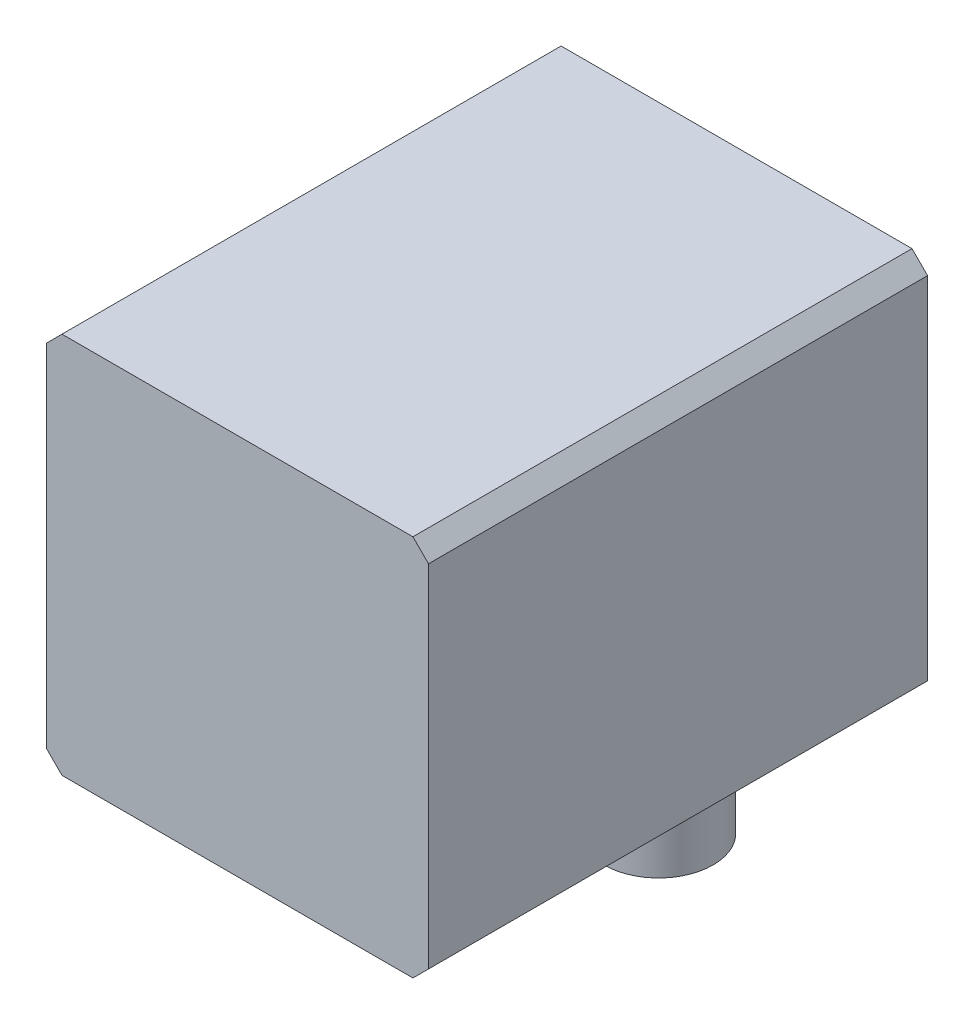
ISO-10303-21;
HEADER;
FILE_DESCRIPTION(('STEP AP214'),'2;1');
FILE_NAME('part.step','',(''),(''),'','','');
FILE_SCHEMA(('AUTOMOTIVE_DESIGN { 1 0 10303 214 1 1 1 1 }'));
ENDSEC;
DATA;
#1=APPLICATION_CONTEXT('core data for automotive mechanical design processes');
#2=APPLICATION_PROTOCOL_DEFINITION('international standard','automotive_design',2000,#1);
#3=PRODUCT_CONTEXT('',#1,'mechanical');
#4=PRODUCT('Part','Part','',(#3));
#5=PRODUCT_RELATED_PRODUCT_CATEGORY('part','',(#4));
#6=PRODUCT_DEFINITION_FORMATION('','',#4);
#7=PRODUCT_DEFINITION_CONTEXT('part definition',#1,'design');
#8=PRODUCT_DEFINITION('design','',#6,#7);
#9=PRODUCT_DEFINITION_SHAPE('','',#8);
#10=(LENGTH_UNIT() NAMED_UNIT(*) SI_UNIT(.MILLI.,.METRE.));
#11=(NAMED_UNIT(*) PLANE_ANGLE_UNIT() SI_UNIT($,.RADIAN.));
#12=(NAMED_UNIT(*) SI_UNIT($,.STERADIAN.) SOLID_ANGLE_UNIT());
#13=UNCERTAINTY_MEASURE_WITH_UNIT(LENGTH_MEASURE(1.E-05),#10,'distance_accuracy_value','');
#14=(GEOMETRIC_REPRESENTATION_CONTEXT(3) GLOBAL_UNCERTAINTY_ASSIGNED_CONTEXT((#13)) GLOBAL_UNIT_ASSIGNED_CONTEXT((#10,
#11,#12)) REPRESENTATION_CONTEXT('',''));
#15=CARTESIAN_POINT('',(0.,0.,0.));
#16=DIRECTION('',(0.,0.,1.));
#17=DIRECTION('',(1.,0.,0.));
#18=AXIS2_PLACEMENT_3D('',#15,#16,#17);
#19=CARTESIAN_POINT('',(-61.25,61.25,160.));
#20=DIRECTION('',(1.,0.,0.));
#21=DIRECTION('',(0.,1.,0.));
#22=AXIS2_PLACEMENT_3D('',#19,#20,#21);
#23=PLANE('',#22);
#24=DIRECTION('',(0.,-1.,0.));
#25=VECTOR('',#24,1.);
#26=CARTESIAN_POINT('',(-61.25,61.25,160.));
#27=LINE('',#26,#25);
#28=CARTESIAN_POINT('',(-61.25,56.25,160.));
#29=VERTEX_POINT('',#28);
#30=CARTESIAN_POINT('',(-61.25,-56.25,160.));
#31=VERTEX_POINT('',#30);
#32=EDGE_CURVE('E138',#29,#31,#27,.T.);
#33=ORIENTED_EDGE('',*,*,#32,.F.);
#34=DIRECTION('',(0.,0.,-1.));
#35=VECTOR('',#34,1.);
#36=CARTESIAN_POINT('',(-61.25,56.25,160.));
#37=LINE('',#36,#35);
#38=CARTESIAN_POINT('',(-61.25,56.25,0.));
#39=VERTEX_POINT('',#38);
#40=EDGE_CURVE('E11',#29,#39,#37,.T.);
#41=ORIENTED_EDGE('',*,*,#40,.T.);
#42=DIRECTION('',(0.,-1.,0.));
#43=VECTOR('',#42,1.);
#44=CARTESIAN_POINT('',(-61.25,61.25,0.));
#45=LINE('',#44,#43);
#46=CARTESIAN_POINT('',(-61.25,-56.25,0.));
#47=VERTEX_POINT('',#46);
#48=EDGE_CURVE('E173',#39,#47,#45,.T.);
#49=ORIENTED_EDGE('',*,*,#48,.T.);
#50=DIRECTION('',(0.,0.,1.));
#51=VECTOR('',#50,1.);
#52=CARTESIAN_POINT('',(-61.25,-56.25,160.));
#53=LINE('',#52,#51);
#54=EDGE_CURVE('E52',#47,#31,#53,.T.);
#55=ORIENTED_EDGE('',*,*,#54,.T.);
#56=EDGE_LOOP('',(#33,#41,#49,#55));
#57=FACE_BOUND('',#56,.T.);
#58=ADVANCED_FACE('F43',(#57),#23,.F.);
#59=CARTESIAN_POINT('',(-61.25,-61.25,160.));
#60=DIRECTION('',(0.,1.,0.));
#61=DIRECTION('',(0.,0.,1.));
#62=AXIS2_PLACEMENT_3D('',#59,#60,#61);
#63=PLANE('',#62);
#64=CARTESIAN_POINT('',(0.,-61.25,25.));
#65=DIRECTION('',(0.,1.,0.));
#66=DIRECTION('',(0.,0.,1.));
#67=AXIS2_PLACEMENT_3D('',#64,#65,#66);
#68=CIRCLE('',#67,17.5);
#69=CARTESIAN_POINT('',(0.,-61.25,42.5));
#70=VERTEX_POINT('',#69);
#71=EDGE_CURVE('E147',#70,#70,#68,.F.);
#72=ORIENTED_EDGE('',*,*,#71,.F.);
#73=EDGE_LOOP('',(#72));
#74=FACE_BOUND('',#73,.T.);
#75=DIRECTION('',(1.,0.,0.));
#76=VECTOR('',#75,1.);
#77=CARTESIAN_POINT('',(-61.25,-61.25,0.));
#78=LINE('',#77,#76);
#79=CARTESIAN_POINT('',(-56.25,-61.25,0.));
#80=VERTEX_POINT('',#79);
#81=CARTESIAN_POINT('',(56.25,-61.25,0.));
#82=VERTEX_POINT('',#81);
#83=EDGE_CURVE('E143',#80,#82,#78,.T.);
#84=ORIENTED_EDGE('',*,*,#83,.T.);
#85=DIRECTION('',(0.,0.,1.));
#86=VECTOR('',#85,1.);
#87=CARTESIAN_POINT('',(56.25,-61.25,160.));
#88=LINE('',#87,#86);
#89=CARTESIAN_POINT('',(56.25,-61.25,160.));
#90=VERTEX_POINT('',#89);
#91=EDGE_CURVE('E59',#82,#90,#88,.T.);
#92=ORIENTED_EDGE('',*,*,#91,.T.);
#93=DIRECTION('',(1.,0.,0.));
#94=VECTOR('',#93,1.);
#95=CARTESIAN_POINT('',(-61.25,-61.25,160.));
#96=LINE('',#95,#94);
#97=CARTESIAN_POINT('',(-56.25,-61.25,160.));
#98=VERTEX_POINT('',#97);
#99=EDGE_CURVE('E141',#98,#90,#96,.T.);
#100=ORIENTED_EDGE('',*,*,#99,.F.);
#101=DIRECTION('',(0.,0.,-1.));
#102=VECTOR('',#101,1.);
#103=CARTESIAN_POINT('',(-56.25,-61.25,160.));
#104=LINE('',#103,#102);
#105=EDGE_CURVE('E165',#98,#80,#104,.T.);
#106=ORIENTED_EDGE('',*,*,#105,.T.);
#107=EDGE_LOOP('',(#84,#92,#100,#106));
#108=FACE_BOUND('',#107,.T.);
#109=ADVANCED_FACE('F180',(#74,#108),#63,.F.);
#110=CARTESIAN_POINT('',(61.25,61.25,160.));
#111=DIRECTION('',(-1.,0.,0.));
#112=DIRECTION('',(0.,-1.,0.));
#113=AXIS2_PLACEMENT_3D('',#110,#111,#112);
#114=PLANE('',#113);
#115=DIRECTION('',(0.,1.,0.));
#116=VECTOR('',#115,1.);
#117=CARTESIAN_POINT('',(61.25,61.25,0.));
#118=LINE('',#117,#116);
#119=CARTESIAN_POINT('',(61.25,-56.25,0.));
#120=VERTEX_POINT('',#119);
#121=CARTESIAN_POINT('',(61.25,56.25,0.));
#122=VERTEX_POINT('',#121);
#123=EDGE_CURVE('E139',#120,#122,#118,.T.);
#124=ORIENTED_EDGE('',*,*,#123,.T.);
#125=DIRECTION('',(0.,0.,1.));
#126=VECTOR('',#125,1.);
#127=CARTESIAN_POINT('',(61.25,56.25,160.));
#128=LINE('',#127,#126);
#129=CARTESIAN_POINT('',(61.25,56.25,160.));
#130=VERTEX_POINT('',#129);
#131=EDGE_CURVE('E116',#122,#130,#128,.T.);
#132=ORIENTED_EDGE('',*,*,#131,.T.);
#133=DIRECTION('',(0.,1.,0.));
#134=VECTOR('',#133,1.);
#135=CARTESIAN_POINT('',(61.25,61.25,160.));
#136=LINE('',#135,#134);
#137=CARTESIAN_POINT('',(61.25,-56.25,160.));
#138=VERTEX_POINT('',#137);
#139=EDGE_CURVE('E185',#138,#130,#136,.T.);
#140=ORIENTED_EDGE('',*,*,#139,.F.);
#141=DIRECTION('',(0.,0.,-1.));
#142=VECTOR('',#141,1.);
#143=CARTESIAN_POINT('',(61.25,-56.25,160.));
#144=LINE('',#143,#142);
#145=EDGE_CURVE('E121',#138,#120,#144,.T.);
#146=ORIENTED_EDGE('',*,*,#145,.T.);
#147=EDGE_LOOP('',(#124,#132,#140,#146));
#148=FACE_BOUND('',#147,.T.);
#149=ADVANCED_FACE('F255',(#148),#114,.F.);
#150=CARTESIAN_POINT('',(-61.25,61.25,160.));
#151=DIRECTION('',(0.,-1.,0.));
#152=DIRECTION('',(0.,0.,-1.));
#153=AXIS2_PLACEMENT_3D('',#150,#151,#152);
#154=PLANE('',#153);
#155=DIRECTION('',(-1.,0.,0.));
#156=VECTOR('',#155,1.);
#157=CARTESIAN_POINT('',(-61.25,61.25,160.));
#158=LINE('',#157,#156);
#159=CARTESIAN_POINT('',(56.25,61.25,160.));
#160=VERTEX_POINT('',#159);
#161=CARTESIAN_POINT('',(-56.2499999999999,61.25,160.));
#162=VERTEX_POINT('',#161);
#163=EDGE_CURVE('E131',#160,#162,#158,.T.);
#164=ORIENTED_EDGE('',*,*,#163,.F.);
#165=DIRECTION('',(0.,0.,-1.));
#166=VECTOR('',#165,1.);
#167=CARTESIAN_POINT('',(56.25,61.25,160.));
#168=LINE('',#167,#166);
#169=CARTESIAN_POINT('',(56.25,61.25,0.));
#170=VERTEX_POINT('',#169);
#171=EDGE_CURVE('E115',#160,#170,#168,.T.);
#172=ORIENTED_EDGE('',*,*,#171,.T.);
#173=DIRECTION('',(-1.,0.,0.));
#174=VECTOR('',#173,1.);
#175=CARTESIAN_POINT('',(-61.25,61.25,0.));
#176=LINE('',#175,#174);
#177=CARTESIAN_POINT('',(-56.2499999999999,61.25,0.));
#178=VERTEX_POINT('',#177);
#179=EDGE_CURVE('E128',#170,#178,#176,.T.);
#180=ORIENTED_EDGE('',*,*,#179,.T.);
#181=DIRECTION('',(0.,0.,1.));
#182=VECTOR('',#181,1.);
#183=CARTESIAN_POINT('',(-56.2499999999999,61.25,160.));
#184=LINE('',#183,#182);
#185=EDGE_CURVE('E133',#178,#162,#184,.T.);
#186=ORIENTED_EDGE('',*,*,#185,.T.);
#187=EDGE_LOOP('',(#164,#172,#180,#186));
#188=FACE_BOUND('',#187,.T.);
#189=ADVANCED_FACE('F127',(#188),#154,.F.);
#190=CARTESIAN_POINT('',(0.,0.,160.));
#191=DIRECTION('',(0.,0.,1.));
#192=DIRECTION('',(1.,0.,0.));
#193=AXIS2_PLACEMENT_3D('',#190,#191,#192);
#194=PLANE('',#193);
#195=ORIENTED_EDGE('',*,*,#139,.T.);
#196=DIRECTION('',(0.707106781186546,-0.707106781186549,0.));
#197=VECTOR('',#196,1.);
#198=CARTESIAN_POINT('',(58.7500000000001,58.7499999999998,160.));
#199=LINE('',#198,#197);
#200=EDGE_CURVE('E163',#130,#160,#199,.F.);
#201=ORIENTED_EDGE('',*,*,#200,.T.);
#202=ORIENTED_EDGE('',*,*,#163,.T.);
#203=DIRECTION('',(0.707106781186549,0.707106781186546,0.));
#204=VECTOR('',#203,1.);
#205=CARTESIAN_POINT('',(-58.7499999999998,58.7500000000001,160.));
#206=LINE('',#205,#204);
#207=EDGE_CURVE('E159',#162,#29,#206,.F.);
#208=ORIENTED_EDGE('',*,*,#207,.T.);
#209=ORIENTED_EDGE('',*,*,#32,.T.);
#210=DIRECTION('',(-0.707106781186546,0.707106781186549,0.));
#211=VECTOR('',#210,1.);
#212=CARTESIAN_POINT('',(-58.7500000000001,-58.7499999999999,160.));
#213=LINE('',#212,#211);
#214=EDGE_CURVE('E66',#31,#98,#213,.F.);
#215=ORIENTED_EDGE('',*,*,#214,.T.);
#216=ORIENTED_EDGE('',*,*,#99,.T.);
#217=DIRECTION('',(-0.70710678118655,-0.707106781186545,0.));
#218=VECTOR('',#217,1.);
#219=CARTESIAN_POINT('',(58.7499999999998,-58.7500000000002,160.));
#220=LINE('',#219,#218);
#221=EDGE_CURVE('E161',#90,#138,#220,.F.);
#222=ORIENTED_EDGE('',*,*,#221,.T.);
#223=EDGE_LOOP('',(#195,#201,#202,#208,#209,#215,#216,#222));
#224=FACE_BOUND('',#223,.T.);
#225=ADVANCED_FACE('F176',(#224),#194,.T.);
#226=CARTESIAN_POINT('',(0.,0.,0.));
#227=DIRECTION('',(0.,0.,1.));
#228=DIRECTION('',(1.,0.,0.));
#229=AXIS2_PLACEMENT_3D('',#226,#227,#228);
#230=PLANE('',#229);
#231=CARTESIAN_POINT('',(48.,-48.,0.));
#232=DIRECTION('',(0.,0.,-1.));
#233=DIRECTION('',(-1.,0.,0.));
#234=AXIS2_PLACEMENT_3D('',#231,#232,#233);
#235=CIRCLE('',#234,2.75);
#236=CARTESIAN_POINT('',(45.25,-48.,0.));
#237=VERTEX_POINT('',#236);
#238=EDGE_CURVE('E202',#237,#237,#235,.T.);
#239=ORIENTED_EDGE('',*,*,#238,.F.);
#240=EDGE_LOOP('',(#239));
#241=FACE_BOUND('',#240,.T.);
#242=CARTESIAN_POINT('',(-48.,-48.,0.));
#243=DIRECTION('',(0.,0.,-1.));
#244=DIRECTION('',(-1.,0.,0.));
#245=AXIS2_PLACEMENT_3D('',#242,#243,#244);
#246=CIRCLE('',#245,2.75);
#247=CARTESIAN_POINT('',(-50.75,-48.,0.));
#248=VERTEX_POINT('',#247);
#249=EDGE_CURVE('E208',#248,#248,#246,.T.);
#250=ORIENTED_EDGE('',*,*,#249,.F.);
#251=EDGE_LOOP('',(#250));
#252=FACE_BOUND('',#251,.T.);
#253=CARTESIAN_POINT('',(-48.,48.,0.));
#254=DIRECTION('',(0.,0.,-1.));
#255=DIRECTION('',(-1.,0.,0.));
#256=AXIS2_PLACEMENT_3D('',#253,#254,#255);
#257=CIRCLE('',#256,2.75);
#258=CARTESIAN_POINT('',(-50.75,48.,0.));
#259=VERTEX_POINT('',#258);
#260=EDGE_CURVE('E214',#259,#259,#257,.T.);
#261=ORIENTED_EDGE('',*,*,#260,.F.);
#262=EDGE_LOOP('',(#261));
#263=FACE_BOUND('',#262,.T.);
#264=CARTESIAN_POINT('',(48.,48.,0.));
#265=DIRECTION('',(0.,0.,-1.));
#266=DIRECTION('',(-1.,0.,0.));
#267=AXIS2_PLACEMENT_3D('',#264,#265,#266);
#268=CIRCLE('',#267,2.75);
#269=CARTESIAN_POINT('',(45.25,48.,0.));
#270=VERTEX_POINT('',#269);
#271=EDGE_CURVE('E196',#270,#270,#268,.T.);
#272=ORIENTED_EDGE('',*,*,#271,.F.);
#273=EDGE_LOOP('',(#272));
#274=FACE_BOUND('',#273,.T.);
#275=ORIENTED_EDGE('',*,*,#179,.F.);
#276=DIRECTION('',(-0.707106781186546,0.707106781186549,0.));
#277=VECTOR('',#276,1.);
#278=CARTESIAN_POINT('',(56.25,61.25,0.));
#279=LINE('',#278,#277);
#280=EDGE_CURVE('E111',#170,#122,#279,.F.);
#281=ORIENTED_EDGE('',*,*,#280,.T.);
#282=ORIENTED_EDGE('',*,*,#123,.F.);
#283=DIRECTION('',(0.70710678118655,0.707106781186545,0.));
#284=VECTOR('',#283,1.);
#285=CARTESIAN_POINT('',(61.25,-56.25,0.));
#286=LINE('',#285,#284);
#287=EDGE_CURVE('E122',#120,#82,#286,.F.);
#288=ORIENTED_EDGE('',*,*,#287,.T.);
#289=ORIENTED_EDGE('',*,*,#83,.F.);
#290=DIRECTION('',(0.707106781186546,-0.707106781186549,0.));
#291=VECTOR('',#290,1.);
#292=CARTESIAN_POINT('',(-56.25,-61.25,0.));
#293=LINE('',#292,#291);
#294=EDGE_CURVE('E132',#80,#47,#293,.F.);
#295=ORIENTED_EDGE('',*,*,#294,.T.);
#296=ORIENTED_EDGE('',*,*,#48,.F.);
#297=DIRECTION('',(-0.707106781186549,-0.707106781186546,0.));
#298=VECTOR('',#297,1.);
#299=CARTESIAN_POINT('',(-61.25,56.25,0.));
#300=LINE('',#299,#298);
#301=EDGE_CURVE('E137',#39,#178,#300,.F.);
#302=ORIENTED_EDGE('',*,*,#301,.T.);
#303=EDGE_LOOP('',(#275,#281,#282,#288,#289,#295,#296,#302));
#304=FACE_BOUND('',#303,.T.);
#305=ADVANCED_FACE('F135',(#241,#252,#263,#274,#304),#230,.F.);
#306=CARTESIAN_POINT('',(0.,-116.75,25.));
#307=DIRECTION('',(0.,1.,0.));
#308=DIRECTION('',(0.,0.,1.));
#309=AXIS2_PLACEMENT_3D('',#306,#307,#308);
#310=CYLINDRICAL_SURFACE('',#309,17.5);
#311=CARTESIAN_POINT('',(0.,-116.75,25.));
#312=DIRECTION('',(0.,-1.,0.));
#313=DIRECTION('',(0.,0.,-1.));
#314=AXIS2_PLACEMENT_3D('',#311,#312,#313);
#315=CIRCLE('',#314,17.5);
#316=CARTESIAN_POINT('',(0.,-116.75,7.5));
#317=VERTEX_POINT('',#316);
#318=EDGE_CURVE('E181',#317,#317,#315,.T.);
#319=ORIENTED_EDGE('',*,*,#318,.F.);
#320=EDGE_LOOP('',(#319));
#321=FACE_BOUND('',#320,.T.);
#322=ORIENTED_EDGE('',*,*,#71,.T.);
#323=EDGE_LOOP('',(#322));
#324=FACE_BOUND('',#323,.T.);
#325=ADVANCED_FACE('F231',(#321,#324),#310,.T.);
#326=CARTESIAN_POINT('',(0.,-116.75,25.));
#327=DIRECTION('',(0.,-1.,0.));
#328=DIRECTION('',(0.,0.,-1.));
#329=AXIS2_PLACEMENT_3D('',#326,#327,#328);
#330=PLANE('',#329);
#331=CARTESIAN_POINT('',(0.,-116.75,25.));
#332=DIRECTION('',(0.,-1.,0.));
#333=DIRECTION('',(0.,0.,-1.));
#334=AXIS2_PLACEMENT_3D('',#331,#332,#333);
#335=CIRCLE('',#334,6.);
#336=CARTESIAN_POINT('',(0.,-116.75,19.));
#337=VERTEX_POINT('',#336);
#338=EDGE_CURVE('E150',#337,#337,#335,.T.);
#339=ORIENTED_EDGE('',*,*,#338,.F.);
#340=EDGE_LOOP('',(#339));
#341=FACE_BOUND('',#340,.T.);
#342=ORIENTED_EDGE('',*,*,#318,.T.);
#343=EDGE_LOOP('',(#342));
#344=FACE_BOUND('',#343,.T.);
#345=ADVANCED_FACE('F293',(#341,#344),#330,.T.);
#346=CARTESIAN_POINT('',(0.,-121.75,25.));
#347=DIRECTION('',(0.,1.,0.));
#348=DIRECTION('',(0.,0.,1.));
#349=AXIS2_PLACEMENT_3D('',#346,#347,#348);
#350=CYLINDRICAL_SURFACE('',#349,6.);
#351=CARTESIAN_POINT('',(0.,-121.75,25.));
#352=DIRECTION('',(0.,-1.,0.));
#353=DIRECTION('',(0.,0.,-1.));
#354=AXIS2_PLACEMENT_3D('',#351,#352,#353);
#355=CIRCLE('',#354,6.);
#356=CARTESIAN_POINT('',(0.,-121.75,19.));
#357=VERTEX_POINT('',#356);
#358=EDGE_CURVE('E190',#357,#357,#355,.T.);
#359=ORIENTED_EDGE('',*,*,#358,.F.);
#360=EDGE_LOOP('',(#359));
#361=FACE_BOUND('',#360,.T.);
#362=ORIENTED_EDGE('',*,*,#338,.T.);
#363=EDGE_LOOP('',(#362));
#364=FACE_BOUND('',#363,.T.);
#365=ADVANCED_FACE('F297',(#361,#364),#350,.T.);
#366=CARTESIAN_POINT('',(0.,-121.75,25.));
#367=DIRECTION('',(0.,-1.,0.));
#368=DIRECTION('',(0.,0.,-1.));
#369=AXIS2_PLACEMENT_3D('',#366,#367,#368);
#370=PLANE('',#369);
#371=ORIENTED_EDGE('',*,*,#358,.T.);
#372=EDGE_LOOP('',(#371));
#373=FACE_BOUND('',#372,.T.);
#374=ADVANCED_FACE('F267',(#373),#370,.T.);
#375=CARTESIAN_POINT('',(56.25,61.25,160.));
#376=DIRECTION('',(-0.707106781186549,-0.707106781186545,0.));
#377=DIRECTION('',(0.,0.,-1.));
#378=AXIS2_PLACEMENT_3D('',#375,#376,#377);
#379=PLANE('',#378);
#380=ORIENTED_EDGE('',*,*,#200,.F.);
#381=ORIENTED_EDGE('',*,*,#131,.F.);
#382=ORIENTED_EDGE('',*,*,#280,.F.);
#383=ORIENTED_EDGE('',*,*,#171,.F.);
#384=EDGE_LOOP('',(#380,#381,#382,#383));
#385=FACE_BOUND('',#384,.T.);
#386=ADVANCED_FACE('F114',(#385),#379,.F.);
#387=CARTESIAN_POINT('',(61.25,-56.25,160.));
#388=DIRECTION('',(-0.707106781186545,0.70710678118655,0.));
#389=DIRECTION('',(0.,0.,-1.));
#390=AXIS2_PLACEMENT_3D('',#387,#388,#389);
#391=PLANE('',#390);
#392=ORIENTED_EDGE('',*,*,#221,.F.);
#393=ORIENTED_EDGE('',*,*,#91,.F.);
#394=ORIENTED_EDGE('',*,*,#287,.F.);
#395=ORIENTED_EDGE('',*,*,#145,.F.);
#396=EDGE_LOOP('',(#392,#393,#394,#395));
#397=FACE_BOUND('',#396,.T.);
#398=ADVANCED_FACE('F266',(#397),#391,.F.);
#399=CARTESIAN_POINT('',(-61.25,56.25,160.));
#400=DIRECTION('',(0.707106781186546,-0.707106781186549,0.));
#401=DIRECTION('',(0.,0.,-1.));
#402=AXIS2_PLACEMENT_3D('',#399,#400,#401);
#403=PLANE('',#402);
#404=ORIENTED_EDGE('',*,*,#207,.F.);
#405=ORIENTED_EDGE('',*,*,#185,.F.);
#406=ORIENTED_EDGE('',*,*,#301,.F.);
#407=ORIENTED_EDGE('',*,*,#40,.F.);
#408=EDGE_LOOP('',(#404,#405,#406,#407));
#409=FACE_BOUND('',#408,.T.);
#410=ADVANCED_FACE('F246',(#409),#403,.F.);
#411=CARTESIAN_POINT('',(-56.25,-61.25,160.));
#412=DIRECTION('',(0.707106781186549,0.707106781186546,0.));
#413=DIRECTION('',(0.,0.,-1.));
#414=AXIS2_PLACEMENT_3D('',#411,#412,#413);
#415=PLANE('',#414);
#416=ORIENTED_EDGE('',*,*,#214,.F.);
#417=ORIENTED_EDGE('',*,*,#54,.F.);
#418=ORIENTED_EDGE('',*,*,#294,.F.);
#419=ORIENTED_EDGE('',*,*,#105,.F.);
#420=EDGE_LOOP('',(#416,#417,#418,#419));
#421=FACE_BOUND('',#420,.T.);
#422=ADVANCED_FACE('F46',(#421),#415,.F.);
#423=CARTESIAN_POINT('',(48.,48.,20.));
#424=DIRECTION('',(0.,0.,-1.));
#425=DIRECTION('',(-1.,0.,0.));
#426=AXIS2_PLACEMENT_3D('',#423,#424,#425);
#427=CYLINDRICAL_SURFACE('',#426,2.75);
#428=CARTESIAN_POINT('',(48.,48.,20.));
#429=DIRECTION('',(0.,0.,-1.));
#430=DIRECTION('',(-1.,0.,0.));
#431=AXIS2_PLACEMENT_3D('',#428,#429,#430);
#432=CIRCLE('',#431,2.75);
#433=CARTESIAN_POINT('',(45.25,48.,20.));
#434=VERTEX_POINT('',#433);
#435=EDGE_CURVE('E195',#434,#434,#432,.T.);
#436=ORIENTED_EDGE('',*,*,#435,.F.);
#437=EDGE_LOOP('',(#436));
#438=FACE_BOUND('',#437,.T.);
#439=ORIENTED_EDGE('',*,*,#271,.T.);
#440=EDGE_LOOP('',(#439));
#441=FACE_BOUND('',#440,.T.);
#442=ADVANCED_FACE('F236',(#438,#441),#427,.F.);
#443=CARTESIAN_POINT('',(48.,48.,20.));
#444=DIRECTION('',(0.,0.,-1.));
#445=DIRECTION('',(-1.,0.,0.));
#446=AXIS2_PLACEMENT_3D('',#443,#444,#445);
#447=PLANE('',#446);
#448=ORIENTED_EDGE('',*,*,#435,.T.);
#449=EDGE_LOOP('',(#448));
#450=FACE_BOUND('',#449,.T.);
#451=ADVANCED_FACE('F225',(#450),#447,.T.);
#452=CARTESIAN_POINT('',(-48.,48.,20.));
#453=DIRECTION('',(0.,0.,-1.));
#454=DIRECTION('',(-1.,0.,0.));
#455=AXIS2_PLACEMENT_3D('',#452,#453,#454);
#456=CYLINDRICAL_SURFACE('',#455,2.75);
#457=CARTESIAN_POINT('',(-48.,48.,20.));
#458=DIRECTION('',(0.,0.,-1.));
#459=DIRECTION('',(-1.,0.,0.));
#460=AXIS2_PLACEMENT_3D('',#457,#458,#459);
#461=CIRCLE('',#460,2.75);
#462=CARTESIAN_POINT('',(-50.75,48.,20.));
#463=VERTEX_POINT('',#462);
#464=EDGE_CURVE('E199',#463,#463,#461,.T.);
#465=ORIENTED_EDGE('',*,*,#464,.F.);
#466=EDGE_LOOP('',(#465));
#467=FACE_BOUND('',#466,.T.);
#468=ORIENTED_EDGE('',*,*,#260,.T.);
#469=EDGE_LOOP('',(#468));
#470=FACE_BOUND('',#469,.T.);
#471=ADVANCED_FACE('F222',(#467,#470),#456,.F.);
#472=CARTESIAN_POINT('',(-48.,48.,20.));
#473=DIRECTION('',(0.,0.,-1.));
#474=DIRECTION('',(-1.,0.,0.));
#475=AXIS2_PLACEMENT_3D('',#472,#473,#474);
#476=PLANE('',#475);
#477=ORIENTED_EDGE('',*,*,#464,.T.);
#478=EDGE_LOOP('',(#477));
#479=FACE_BOUND('',#478,.T.);
#480=ADVANCED_FACE('F220',(#479),#476,.T.);
#481=CARTESIAN_POINT('',(-48.,-48.,20.));
#482=DIRECTION('',(0.,0.,-1.));
#483=DIRECTION('',(-1.,0.,0.));
#484=AXIS2_PLACEMENT_3D('',#481,#482,#483);
#485=CYLINDRICAL_SURFACE('',#484,2.75);
#486=CARTESIAN_POINT('',(-48.,-48.,20.));
#487=DIRECTION('',(0.,0.,-1.));
#488=DIRECTION('',(-1.,0.,0.));
#489=AXIS2_PLACEMENT_3D('',#486,#487,#488);
#490=CIRCLE('',#489,2.75);
#491=CARTESIAN_POINT('',(-50.75,-48.,20.));
#492=VERTEX_POINT('',#491);
#493=EDGE_CURVE('E211',#492,#492,#490,.T.);
#494=ORIENTED_EDGE('',*,*,#493,.F.);
#495=EDGE_LOOP('',(#494));
#496=FACE_BOUND('',#495,.T.);
#497=ORIENTED_EDGE('',*,*,#249,.T.);
#498=EDGE_LOOP('',(#497));
#499=FACE_BOUND('',#498,.T.);
#500=ADVANCED_FACE('F374',(#496,#499),#485,.F.);
#501=CARTESIAN_POINT('',(-48.,-48.,20.));
#502=DIRECTION('',(0.,0.,-1.));
#503=DIRECTION('',(-1.,0.,0.));
#504=AXIS2_PLACEMENT_3D('',#501,#502,#503);
#505=PLANE('',#504);
#506=ORIENTED_EDGE('',*,*,#493,.T.);
#507=EDGE_LOOP('',(#506));
#508=FACE_BOUND('',#507,.T.);
#509=ADVANCED_FACE('F381',(#508),#505,.T.);
#510=CARTESIAN_POINT('',(48.,-48.,20.));
#511=DIRECTION('',(0.,0.,-1.));
#512=DIRECTION('',(-1.,0.,0.));
#513=AXIS2_PLACEMENT_3D('',#510,#511,#512);
#514=CYLINDRICAL_SURFACE('',#513,2.75);
#515=CARTESIAN_POINT('',(48.,-48.,20.));
#516=DIRECTION('',(0.,0.,-1.));
#517=DIRECTION('',(-1.,0.,0.));
#518=AXIS2_PLACEMENT_3D('',#515,#516,#517);
#519=CIRCLE('',#518,2.75);
#520=CARTESIAN_POINT('',(45.25,-48.,20.));
#521=VERTEX_POINT('',#520);
#522=EDGE_CURVE('E205',#521,#521,#519,.T.);
#523=ORIENTED_EDGE('',*,*,#522,.F.);
#524=EDGE_LOOP('',(#523));
#525=FACE_BOUND('',#524,.T.);
#526=ORIENTED_EDGE('',*,*,#238,.T.);
#527=EDGE_LOOP('',(#526));
#528=FACE_BOUND('',#527,.T.);
#529=ADVANCED_FACE('F389',(#525,#528),#514,.F.);
#530=CARTESIAN_POINT('',(48.,-48.,20.));
#531=DIRECTION('',(0.,0.,-1.));
#532=DIRECTION('',(-1.,0.,0.));
#533=AXIS2_PLACEMENT_3D('',#530,#531,#532);
#534=PLANE('',#533);
#535=ORIENTED_EDGE('',*,*,#522,.T.);
#536=EDGE_LOOP('',(#535));
#537=FACE_BOUND('',#536,.T.);
#538=ADVANCED_FACE('F397',(#537),#534,.T.);
#539=CLOSED_SHELL('',(#58,#109,#149,#189,#225,#305,#325,#345,#365,#374,#386,#398,#410,#422,#442,
#451,#471,#480,#500,#509,#529,#538));
#540=MANIFOLD_SOLID_BREP('B2',#539);
#541=ADVANCED_BREP_SHAPE_REPRESENTATION('',(#18,#540),#14);
#542=SHAPE_DEFINITION_REPRESENTATION(#9,#541);
ENDSEC;
END-ISO-10303-21;
